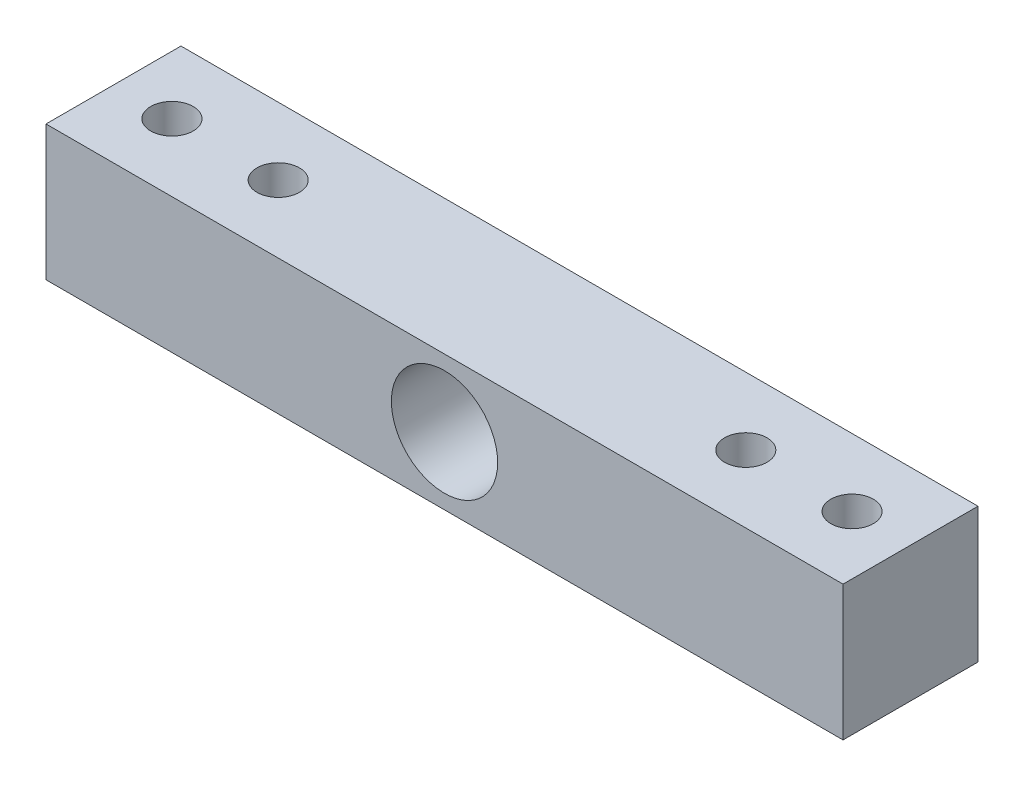
ISO-10303-21;
HEADER;
FILE_DESCRIPTION(('STEP AP214'),'2;1');
FILE_NAME('part.step','',(''),(''),'','','');
FILE_SCHEMA(('AUTOMOTIVE_DESIGN { 1 0 10303 214 1 1 1 1 }'));
ENDSEC;
DATA;
#1=APPLICATION_CONTEXT('core data for automotive mechanical design processes');
#2=APPLICATION_PROTOCOL_DEFINITION('international standard','automotive_design',2000,#1);
#3=PRODUCT_CONTEXT('',#1,'mechanical');
#4=PRODUCT('Part','Part','',(#3));
#5=PRODUCT_RELATED_PRODUCT_CATEGORY('part','',(#4));
#6=PRODUCT_DEFINITION_FORMATION('','',#4);
#7=PRODUCT_DEFINITION_CONTEXT('part definition',#1,'design');
#8=PRODUCT_DEFINITION('design','',#6,#7);
#9=PRODUCT_DEFINITION_SHAPE('','',#8);
#10=(LENGTH_UNIT() NAMED_UNIT(*) SI_UNIT(.MILLI.,.METRE.));
#11=(NAMED_UNIT(*) PLANE_ANGLE_UNIT() SI_UNIT($,.RADIAN.));
#12=(NAMED_UNIT(*) SI_UNIT($,.STERADIAN.) SOLID_ANGLE_UNIT());
#13=UNCERTAINTY_MEASURE_WITH_UNIT(LENGTH_MEASURE(1.E-05),#10,'distance_accuracy_value','');
#14=(GEOMETRIC_REPRESENTATION_CONTEXT(3) GLOBAL_UNCERTAINTY_ASSIGNED_CONTEXT((#13)) GLOBAL_UNIT_ASSIGNED_CONTEXT((#10,
#11,#12)) REPRESENTATION_CONTEXT('',''));
#15=CARTESIAN_POINT('',(0.,0.,0.));
#16=DIRECTION('',(0.,0.,1.));
#17=DIRECTION('',(1.,0.,0.));
#18=AXIS2_PLACEMENT_3D('',#15,#16,#17);
#19=CARTESIAN_POINT('',(58.7400681044267,12.7,-98.8209988649263));
#20=DIRECTION('',(0.,0.,-1.));
#21=DIRECTION('',(-1.,0.,0.));
#22=AXIS2_PLACEMENT_3D('',#19,#20,#21);
#23=PLANE('',#22);
#24=CARTESIAN_POINT('',(96.2400681044267,6.35,-98.8209988649263));
#25=DIRECTION('',(0.,0.,1.));
#26=DIRECTION('',(1.,0.,0.));
#27=AXIS2_PLACEMENT_3D('',#24,#25,#26);
#28=CIRCLE('',#27,5.);
#29=CARTESIAN_POINT('',(101.240068104427,6.35,-98.8209988649263));
#30=VERTEX_POINT('',#29);
#31=EDGE_CURVE('E162',#30,#30,#28,.T.);
#32=ORIENTED_EDGE('',*,*,#31,.F.);
#33=EDGE_LOOP('',(#32));
#34=FACE_BOUND('',#33,.T.);
#35=DIRECTION('',(1.,0.,0.));
#36=VECTOR('',#35,1.);
#37=CARTESIAN_POINT('',(58.7400681044267,0.,-98.8209988649263));
#38=LINE('',#37,#36);
#39=CARTESIAN_POINT('',(58.7400681044267,0.,-98.8209988649263));
#40=VERTEX_POINT('',#39);
#41=CARTESIAN_POINT('',(133.740068104427,0.,-98.8209988649263));
#42=VERTEX_POINT('',#41);
#43=EDGE_CURVE('E111',#40,#42,#38,.T.);
#44=ORIENTED_EDGE('',*,*,#43,.T.);
#45=DIRECTION('',(0.,-1.,0.));
#46=VECTOR('',#45,1.);
#47=CARTESIAN_POINT('',(133.740068104427,12.7,-98.8209988649263));
#48=LINE('',#47,#46);
#49=CARTESIAN_POINT('',(133.740068104427,12.7,-98.8209988649263));
#50=VERTEX_POINT('',#49);
#51=EDGE_CURVE('E11',#50,#42,#48,.T.);
#52=ORIENTED_EDGE('',*,*,#51,.F.);
#53=DIRECTION('',(1.,0.,0.));
#54=VECTOR('',#53,1.);
#55=CARTESIAN_POINT('',(58.7400681044267,12.7,-98.8209988649263));
#56=LINE('',#55,#54);
#57=CARTESIAN_POINT('',(58.7400681044267,12.7,-98.8209988649263));
#58=VERTEX_POINT('',#57);
#59=EDGE_CURVE('E93',#58,#50,#56,.T.);
#60=ORIENTED_EDGE('',*,*,#59,.F.);
#61=DIRECTION('',(0.,-1.,0.));
#62=VECTOR('',#61,1.);
#63=CARTESIAN_POINT('',(58.7400681044267,12.7,-98.8209988649263));
#64=LINE('',#63,#62);
#65=EDGE_CURVE('E60',#58,#40,#64,.T.);
#66=ORIENTED_EDGE('',*,*,#65,.T.);
#67=EDGE_LOOP('',(#44,#52,#60,#66));
#68=FACE_BOUND('',#67,.T.);
#69=ADVANCED_FACE('F43',(#34,#68),#23,.F.);
#70=CARTESIAN_POINT('',(133.740068104427,12.7,-98.8209988649263));
#71=DIRECTION('',(-1.,0.,0.));
#72=DIRECTION('',(0.,0.,1.));
#73=AXIS2_PLACEMENT_3D('',#70,#71,#72);
#74=PLANE('',#73);
#75=DIRECTION('',(0.,0.,-1.));
#76=VECTOR('',#75,1.);
#77=CARTESIAN_POINT('',(133.740068104427,0.,-98.8209988649263));
#78=LINE('',#77,#76);
#79=CARTESIAN_POINT('',(133.740068104427,0.,-111.520998864926));
#80=VERTEX_POINT('',#79);
#81=EDGE_CURVE('E99',#42,#80,#78,.T.);
#82=ORIENTED_EDGE('',*,*,#81,.T.);
#83=DIRECTION('',(0.,-1.,0.));
#84=VECTOR('',#83,1.);
#85=CARTESIAN_POINT('',(133.740068104427,12.7,-111.520998864926));
#86=LINE('',#85,#84);
#87=CARTESIAN_POINT('',(133.740068104427,12.7,-111.520998864926));
#88=VERTEX_POINT('',#87);
#89=EDGE_CURVE('E52',#88,#80,#86,.T.);
#90=ORIENTED_EDGE('',*,*,#89,.F.);
#91=DIRECTION('',(0.,0.,-1.));
#92=VECTOR('',#91,1.);
#93=CARTESIAN_POINT('',(133.740068104427,12.7,-98.8209988649263));
#94=LINE('',#93,#92);
#95=EDGE_CURVE('E85',#50,#88,#94,.T.);
#96=ORIENTED_EDGE('',*,*,#95,.F.);
#97=ORIENTED_EDGE('',*,*,#51,.T.);
#98=EDGE_LOOP('',(#82,#90,#96,#97));
#99=FACE_BOUND('',#98,.T.);
#100=ADVANCED_FACE('F98',(#99),#74,.F.);
#101=CARTESIAN_POINT('',(58.7400681044267,12.7,-111.520998864926));
#102=DIRECTION('',(0.,0.,-1.));
#103=DIRECTION('',(-1.,0.,0.));
#104=AXIS2_PLACEMENT_3D('',#101,#102,#103);
#105=PLANE('',#104);
#106=CARTESIAN_POINT('',(96.2400681044267,6.35,-111.520998864926));
#107=DIRECTION('',(0.,0.,1.));
#108=DIRECTION('',(1.,0.,0.));
#109=AXIS2_PLACEMENT_3D('',#106,#107,#108);
#110=CIRCLE('',#109,5.);
#111=CARTESIAN_POINT('',(101.240068104427,6.35,-111.520998864926));
#112=VERTEX_POINT('',#111);
#113=EDGE_CURVE('E143',#112,#112,#110,.T.);
#114=ORIENTED_EDGE('',*,*,#113,.T.);
#115=EDGE_LOOP('',(#114));
#116=FACE_BOUND('',#115,.T.);
#117=DIRECTION('',(1.,0.,0.));
#118=VECTOR('',#117,1.);
#119=CARTESIAN_POINT('',(58.7400681044267,0.,-111.520998864926));
#120=LINE('',#119,#118);
#121=CARTESIAN_POINT('',(58.7400681044267,0.,-111.520998864926));
#122=VERTEX_POINT('',#121);
#123=EDGE_CURVE('E117',#122,#80,#120,.T.);
#124=ORIENTED_EDGE('',*,*,#123,.F.);
#125=DIRECTION('',(0.,-1.,0.));
#126=VECTOR('',#125,1.);
#127=CARTESIAN_POINT('',(58.7400681044267,12.7,-111.520998864926));
#128=LINE('',#127,#126);
#129=CARTESIAN_POINT('',(58.7400681044267,12.7,-111.520998864926));
#130=VERTEX_POINT('',#129);
#131=EDGE_CURVE('E74',#130,#122,#128,.T.);
#132=ORIENTED_EDGE('',*,*,#131,.F.);
#133=DIRECTION('',(1.,0.,0.));
#134=VECTOR('',#133,1.);
#135=CARTESIAN_POINT('',(58.7400681044267,12.7,-111.520998864926));
#136=LINE('',#135,#134);
#137=EDGE_CURVE('E92',#130,#88,#136,.T.);
#138=ORIENTED_EDGE('',*,*,#137,.T.);
#139=ORIENTED_EDGE('',*,*,#89,.T.);
#140=EDGE_LOOP('',(#124,#132,#138,#139));
#141=FACE_BOUND('',#140,.T.);
#142=ADVANCED_FACE('F103',(#116,#141),#105,.T.);
#143=CARTESIAN_POINT('',(58.7400681044267,12.7,-98.8209988649263));
#144=DIRECTION('',(-1.,0.,0.));
#145=DIRECTION('',(0.,0.,1.));
#146=AXIS2_PLACEMENT_3D('',#143,#144,#145);
#147=PLANE('',#146);
#148=DIRECTION('',(0.,0.,-1.));
#149=VECTOR('',#148,1.);
#150=CARTESIAN_POINT('',(58.7400681044267,0.,-98.8209988649263));
#151=LINE('',#150,#149);
#152=EDGE_CURVE('E120',#40,#122,#151,.T.);
#153=ORIENTED_EDGE('',*,*,#152,.F.);
#154=ORIENTED_EDGE('',*,*,#65,.F.);
#155=DIRECTION('',(0.,0.,-1.));
#156=VECTOR('',#155,1.);
#157=CARTESIAN_POINT('',(58.7400681044267,12.7,-98.8209988649263));
#158=LINE('',#157,#156);
#159=EDGE_CURVE('E105',#58,#130,#158,.T.);
#160=ORIENTED_EDGE('',*,*,#159,.T.);
#161=ORIENTED_EDGE('',*,*,#131,.T.);
#162=EDGE_LOOP('',(#153,#154,#160,#161));
#163=FACE_BOUND('',#162,.T.);
#164=ADVANCED_FACE('F180',(#163),#147,.T.);
#165=CARTESIAN_POINT('',(0.,12.7,0.));
#166=DIRECTION('',(0.,1.,0.));
#167=DIRECTION('',(0.,0.,1.));
#168=AXIS2_PLACEMENT_3D('',#165,#166,#167);
#169=PLANE('',#168);
#170=CARTESIAN_POINT('',(128.240068104427,12.7,-105.170998864926));
#171=DIRECTION('',(0.,1.,0.));
#172=DIRECTION('',(0.,0.,1.));
#173=AXIS2_PLACEMENT_3D('',#170,#171,#172);
#174=CIRCLE('',#173,2.);
#175=CARTESIAN_POINT('',(128.240068104427,12.7,-103.170998864926));
#176=VERTEX_POINT('',#175);
#177=EDGE_CURVE('E142',#176,#176,#174,.T.);
#178=ORIENTED_EDGE('',*,*,#177,.F.);
#179=EDGE_LOOP('',(#178));
#180=FACE_BOUND('',#179,.T.);
#181=CARTESIAN_POINT('',(118.240068104427,12.7,-105.170998864926));
#182=DIRECTION('',(0.,1.,0.));
#183=DIRECTION('',(0.,0.,1.));
#184=AXIS2_PLACEMENT_3D('',#181,#182,#183);
#185=CIRCLE('',#184,2.);
#186=CARTESIAN_POINT('',(118.240068104427,12.7,-103.170998864926));
#187=VERTEX_POINT('',#186);
#188=EDGE_CURVE('E151',#187,#187,#185,.T.);
#189=ORIENTED_EDGE('',*,*,#188,.F.);
#190=EDGE_LOOP('',(#189));
#191=FACE_BOUND('',#190,.T.);
#192=CARTESIAN_POINT('',(64.2400681044267,12.7,-105.170998864926));
#193=DIRECTION('',(0.,1.,0.));
#194=DIRECTION('',(0.,0.,1.));
#195=AXIS2_PLACEMENT_3D('',#192,#193,#194);
#196=CIRCLE('',#195,2.);
#197=CARTESIAN_POINT('',(64.2400681044267,12.7,-103.170998864926));
#198=VERTEX_POINT('',#197);
#199=EDGE_CURVE('E134',#198,#198,#196,.T.);
#200=ORIENTED_EDGE('',*,*,#199,.F.);
#201=EDGE_LOOP('',(#200));
#202=FACE_BOUND('',#201,.T.);
#203=CARTESIAN_POINT('',(74.2400681044267,12.7,-105.170998864926));
#204=DIRECTION('',(0.,1.,0.));
#205=DIRECTION('',(0.,0.,1.));
#206=AXIS2_PLACEMENT_3D('',#203,#204,#205);
#207=CIRCLE('',#206,2.);
#208=CARTESIAN_POINT('',(74.2400681044267,12.7,-103.170998864926));
#209=VERTEX_POINT('',#208);
#210=EDGE_CURVE('E130',#209,#209,#207,.T.);
#211=ORIENTED_EDGE('',*,*,#210,.F.);
#212=EDGE_LOOP('',(#211));
#213=FACE_BOUND('',#212,.T.);
#214=ORIENTED_EDGE('',*,*,#59,.T.);
#215=ORIENTED_EDGE('',*,*,#95,.T.);
#216=ORIENTED_EDGE('',*,*,#137,.F.);
#217=ORIENTED_EDGE('',*,*,#159,.F.);
#218=EDGE_LOOP('',(#214,#215,#216,#217));
#219=FACE_BOUND('',#218,.T.);
#220=ADVANCED_FACE('F89',(#180,#191,#202,#213,#219),#169,.T.);
#221=CARTESIAN_POINT('',(0.,0.,0.));
#222=DIRECTION('',(0.,1.,0.));
#223=DIRECTION('',(0.,0.,1.));
#224=AXIS2_PLACEMENT_3D('',#221,#222,#223);
#225=PLANE('',#224);
#226=CARTESIAN_POINT('',(128.240068104427,0.,-105.170998864926));
#227=DIRECTION('',(0.,1.,0.));
#228=DIRECTION('',(0.,0.,1.));
#229=AXIS2_PLACEMENT_3D('',#226,#227,#228);
#230=CIRCLE('',#229,2.);
#231=CARTESIAN_POINT('',(128.240068104427,0.,-103.170998864926));
#232=VERTEX_POINT('',#231);
#233=EDGE_CURVE('E138',#232,#232,#230,.T.);
#234=ORIENTED_EDGE('',*,*,#233,.T.);
#235=EDGE_LOOP('',(#234));
#236=FACE_BOUND('',#235,.T.);
#237=CARTESIAN_POINT('',(118.240068104427,0.,-105.170998864926));
#238=DIRECTION('',(0.,1.,0.));
#239=DIRECTION('',(0.,0.,1.));
#240=AXIS2_PLACEMENT_3D('',#237,#238,#239);
#241=CIRCLE('',#240,2.);
#242=CARTESIAN_POINT('',(118.240068104427,0.,-103.170998864926));
#243=VERTEX_POINT('',#242);
#244=EDGE_CURVE('E147',#243,#243,#241,.T.);
#245=ORIENTED_EDGE('',*,*,#244,.T.);
#246=EDGE_LOOP('',(#245));
#247=FACE_BOUND('',#246,.T.);
#248=CARTESIAN_POINT('',(64.2400681044267,0.,-105.170998864926));
#249=DIRECTION('',(0.,1.,0.));
#250=DIRECTION('',(0.,0.,1.));
#251=AXIS2_PLACEMENT_3D('',#248,#249,#250);
#252=CIRCLE('',#251,2.);
#253=CARTESIAN_POINT('',(64.2400681044267,0.,-103.170998864926));
#254=VERTEX_POINT('',#253);
#255=EDGE_CURVE('E155',#254,#254,#252,.T.);
#256=ORIENTED_EDGE('',*,*,#255,.T.);
#257=EDGE_LOOP('',(#256));
#258=FACE_BOUND('',#257,.T.);
#259=CARTESIAN_POINT('',(74.2400681044267,0.,-105.170998864926));
#260=DIRECTION('',(0.,1.,0.));
#261=DIRECTION('',(0.,0.,1.));
#262=AXIS2_PLACEMENT_3D('',#259,#260,#261);
#263=CIRCLE('',#262,2.);
#264=CARTESIAN_POINT('',(74.2400681044267,0.,-103.170998864926));
#265=VERTEX_POINT('',#264);
#266=EDGE_CURVE('E114',#265,#265,#263,.T.);
#267=ORIENTED_EDGE('',*,*,#266,.T.);
#268=EDGE_LOOP('',(#267));
#269=FACE_BOUND('',#268,.T.);
#270=ORIENTED_EDGE('',*,*,#43,.F.);
#271=ORIENTED_EDGE('',*,*,#152,.T.);
#272=ORIENTED_EDGE('',*,*,#123,.T.);
#273=ORIENTED_EDGE('',*,*,#81,.F.);
#274=EDGE_LOOP('',(#270,#271,#272,#273));
#275=FACE_BOUND('',#274,.T.);
#276=ADVANCED_FACE('F179',(#236,#247,#258,#269,#275),#225,.F.);
#277=CARTESIAN_POINT('',(74.2400681044267,0.,-105.170998864926));
#278=DIRECTION('',(0.,1.,0.));
#279=DIRECTION('',(0.,0.,1.));
#280=AXIS2_PLACEMENT_3D('',#277,#278,#279);
#281=CYLINDRICAL_SURFACE('',#280,2.);
#282=ORIENTED_EDGE('',*,*,#266,.F.);
#283=EDGE_LOOP('',(#282));
#284=FACE_BOUND('',#283,.T.);
#285=ORIENTED_EDGE('',*,*,#210,.T.);
#286=EDGE_LOOP('',(#285));
#287=FACE_BOUND('',#286,.T.);
#288=ADVANCED_FACE('F235',(#284,#287),#281,.F.);
#289=CARTESIAN_POINT('',(64.2400681044267,0.,-105.170998864926));
#290=DIRECTION('',(0.,1.,0.));
#291=DIRECTION('',(0.,0.,1.));
#292=AXIS2_PLACEMENT_3D('',#289,#290,#291);
#293=CYLINDRICAL_SURFACE('',#292,2.);
#294=ORIENTED_EDGE('',*,*,#255,.F.);
#295=EDGE_LOOP('',(#294));
#296=FACE_BOUND('',#295,.T.);
#297=ORIENTED_EDGE('',*,*,#199,.T.);
#298=EDGE_LOOP('',(#297));
#299=FACE_BOUND('',#298,.T.);
#300=ADVANCED_FACE('F227',(#296,#299),#293,.F.);
#301=CARTESIAN_POINT('',(118.240068104427,0.,-105.170998864926));
#302=DIRECTION('',(0.,1.,0.));
#303=DIRECTION('',(0.,0.,1.));
#304=AXIS2_PLACEMENT_3D('',#301,#302,#303);
#305=CYLINDRICAL_SURFACE('',#304,2.);
#306=ORIENTED_EDGE('',*,*,#244,.F.);
#307=EDGE_LOOP('',(#306));
#308=FACE_BOUND('',#307,.T.);
#309=ORIENTED_EDGE('',*,*,#188,.T.);
#310=EDGE_LOOP('',(#309));
#311=FACE_BOUND('',#310,.T.);
#312=ADVANCED_FACE('F220',(#308,#311),#305,.F.);
#313=CARTESIAN_POINT('',(128.240068104427,0.,-105.170998864926));
#314=DIRECTION('',(0.,1.,0.));
#315=DIRECTION('',(0.,0.,1.));
#316=AXIS2_PLACEMENT_3D('',#313,#314,#315);
#317=CYLINDRICAL_SURFACE('',#316,2.);
#318=ORIENTED_EDGE('',*,*,#233,.F.);
#319=EDGE_LOOP('',(#318));
#320=FACE_BOUND('',#319,.T.);
#321=ORIENTED_EDGE('',*,*,#177,.T.);
#322=EDGE_LOOP('',(#321));
#323=FACE_BOUND('',#322,.T.);
#324=ADVANCED_FACE('F174',(#320,#323),#317,.F.);
#325=CARTESIAN_POINT('',(96.2400681044267,6.35,-111.520998864926));
#326=DIRECTION('',(0.,0.,1.));
#327=DIRECTION('',(1.,0.,0.));
#328=AXIS2_PLACEMENT_3D('',#325,#326,#327);
#329=CYLINDRICAL_SURFACE('',#328,5.);
#330=ORIENTED_EDGE('',*,*,#113,.F.);
#331=EDGE_LOOP('',(#330));
#332=FACE_BOUND('',#331,.T.);
#333=ORIENTED_EDGE('',*,*,#31,.T.);
#334=EDGE_LOOP('',(#333));
#335=FACE_BOUND('',#334,.T.);
#336=ADVANCED_FACE('F171',(#332,#335),#329,.F.);
#337=CLOSED_SHELL('',(#69,#100,#142,#164,#220,#276,#288,#300,#312,#324,#336));
#338=MANIFOLD_SOLID_BREP('B2',#337);
#339=ADVANCED_BREP_SHAPE_REPRESENTATION('',(#18,#338),#14);
#340=SHAPE_DEFINITION_REPRESENTATION(#9,#339);
ENDSEC;
END-ISO-10303-21;
